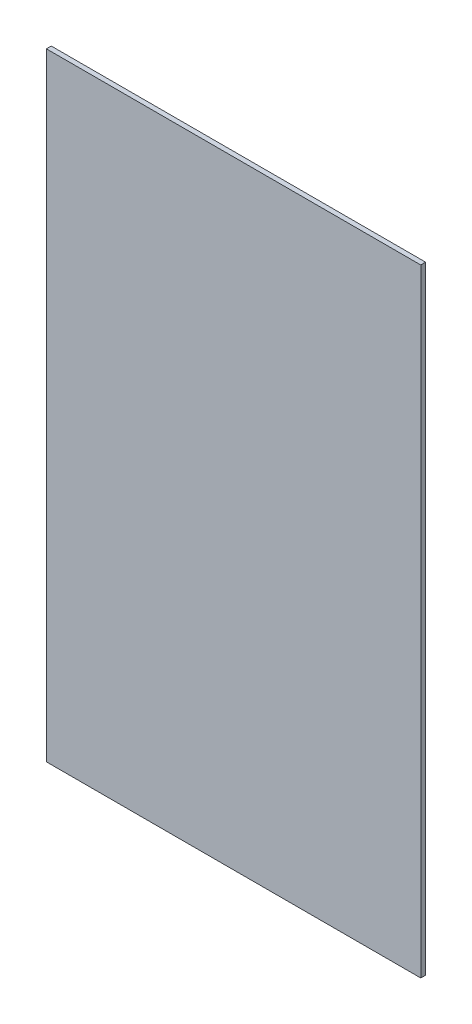
ISO-10303-21;
HEADER;
FILE_DESCRIPTION(('STEP AP214'),'2;1');
FILE_NAME('part.step','',(''),(''),'','','');
FILE_SCHEMA(('AUTOMOTIVE_DESIGN { 1 0 10303 214 1 1 1 1 }'));
ENDSEC;
DATA;
#1=APPLICATION_CONTEXT('core data for automotive mechanical design processes');
#2=APPLICATION_PROTOCOL_DEFINITION('international standard','automotive_design',2000,#1);
#3=PRODUCT_CONTEXT('',#1,'mechanical');
#4=PRODUCT('Part','Part','',(#3));
#5=PRODUCT_RELATED_PRODUCT_CATEGORY('part','',(#4));
#6=PRODUCT_DEFINITION_FORMATION('','',#4);
#7=PRODUCT_DEFINITION_CONTEXT('part definition',#1,'design');
#8=PRODUCT_DEFINITION('design','',#6,#7);
#9=PRODUCT_DEFINITION_SHAPE('','',#8);
#10=(LENGTH_UNIT() NAMED_UNIT(*) SI_UNIT(.MILLI.,.METRE.));
#11=(NAMED_UNIT(*) PLANE_ANGLE_UNIT() SI_UNIT($,.RADIAN.));
#12=(NAMED_UNIT(*) SI_UNIT($,.STERADIAN.) SOLID_ANGLE_UNIT());
#13=UNCERTAINTY_MEASURE_WITH_UNIT(LENGTH_MEASURE(1.E-05),#10,'distance_accuracy_value','');
#14=(GEOMETRIC_REPRESENTATION_CONTEXT(3) GLOBAL_UNCERTAINTY_ASSIGNED_CONTEXT((#13)) GLOBAL_UNIT_ASSIGNED_CONTEXT((#10,
#11,#12)) REPRESENTATION_CONTEXT('',''));
#15=CARTESIAN_POINT('',(0.,0.,0.));
#16=DIRECTION('',(0.,0.,1.));
#17=DIRECTION('',(1.,0.,0.));
#18=AXIS2_PLACEMENT_3D('',#15,#16,#17);
#19=CARTESIAN_POINT('',(0.,0.,0.));
#20=DIRECTION('',(0.,0.,1.));
#21=DIRECTION('',(1.,0.,0.));
#22=AXIS2_PLACEMENT_3D('',#19,#20,#21);
#23=PLANE('',#22);
#24=DIRECTION('',(1.,0.,0.));
#25=VECTOR('',#24,1.);
#26=CARTESIAN_POINT('',(3.85,6.35,0.));
#27=LINE('',#26,#25);
#28=CARTESIAN_POINT('',(3.85,6.35,0.));
#29=VERTEX_POINT('',#28);
#30=CARTESIAN_POINT('',(-3.85,6.35,0.));
#31=VERTEX_POINT('',#30);
#32=EDGE_CURVE('E79',#29,#31,#27,.F.);
#33=ORIENTED_EDGE('',*,*,#32,.F.);
#34=DIRECTION('',(0.,1.,0.));
#35=VECTOR('',#34,1.);
#36=CARTESIAN_POINT('',(3.85,-6.35,0.));
#37=LINE('',#36,#35);
#38=CARTESIAN_POINT('',(3.85,-6.35,0.));
#39=VERTEX_POINT('',#38);
#40=EDGE_CURVE('E55',#39,#29,#37,.T.);
#41=ORIENTED_EDGE('',*,*,#40,.F.);
#42=DIRECTION('',(1.,0.,0.));
#43=VECTOR('',#42,1.);
#44=CARTESIAN_POINT('',(-3.85,-6.35,0.));
#45=LINE('',#44,#43);
#46=CARTESIAN_POINT('',(-3.85,-6.35,0.));
#47=VERTEX_POINT('',#46);
#48=EDGE_CURVE('E57',#47,#39,#45,.T.);
#49=ORIENTED_EDGE('',*,*,#48,.F.);
#50=DIRECTION('',(0.,1.,0.));
#51=VECTOR('',#50,1.);
#52=CARTESIAN_POINT('',(-3.85,6.35,0.));
#53=LINE('',#52,#51);
#54=EDGE_CURVE('E20',#31,#47,#53,.F.);
#55=ORIENTED_EDGE('',*,*,#54,.F.);
#56=EDGE_LOOP('',(#33,#41,#49,#55));
#57=FACE_BOUND('',#56,.T.);
#58=ADVANCED_FACE('F17',(#57),#23,.F.);
#59=CARTESIAN_POINT('',(-3.85,6.35,0.));
#60=DIRECTION('',(-1.,0.,0.));
#61=DIRECTION('',(0.,0.,1.));
#62=AXIS2_PLACEMENT_3D('',#59,#60,#61);
#63=PLANE('',#62);
#64=DIRECTION('',(0.,1.,0.));
#65=VECTOR('',#64,1.);
#66=CARTESIAN_POINT('',(-3.85,0.,0.1));
#67=LINE('',#66,#65);
#68=CARTESIAN_POINT('',(-3.85,6.35,0.1));
#69=VERTEX_POINT('',#68);
#70=CARTESIAN_POINT('',(-3.85,-6.35,0.1));
#71=VERTEX_POINT('',#70);
#72=EDGE_CURVE('E83',#69,#71,#67,.F.);
#73=ORIENTED_EDGE('',*,*,#72,.F.);
#74=DIRECTION('',(0.,0.,1.));
#75=VECTOR('',#74,1.);
#76=CARTESIAN_POINT('',(-3.85,6.35,0.));
#77=LINE('',#76,#75);
#78=EDGE_CURVE('E68',#31,#69,#77,.T.);
#79=ORIENTED_EDGE('',*,*,#78,.F.);
#80=ORIENTED_EDGE('',*,*,#54,.T.);
#81=DIRECTION('',(0.,0.,-1.));
#82=VECTOR('',#81,1.);
#83=CARTESIAN_POINT('',(-3.85,-6.35,0.));
#84=LINE('',#83,#82);
#85=EDGE_CURVE('E63',#71,#47,#84,.T.);
#86=ORIENTED_EDGE('',*,*,#85,.F.);
#87=EDGE_LOOP('',(#73,#79,#80,#86));
#88=FACE_BOUND('',#87,.T.);
#89=ADVANCED_FACE('F65',(#88),#63,.T.);
#90=CARTESIAN_POINT('',(-3.85,-6.35,0.));
#91=DIRECTION('',(0.,-1.,0.));
#92=DIRECTION('',(0.,0.,-1.));
#93=AXIS2_PLACEMENT_3D('',#90,#91,#92);
#94=PLANE('',#93);
#95=DIRECTION('',(1.,0.,0.));
#96=VECTOR('',#95,1.);
#97=CARTESIAN_POINT('',(0.,-6.35,0.1));
#98=LINE('',#97,#96);
#99=CARTESIAN_POINT('',(3.85,-6.35,0.1));
#100=VERTEX_POINT('',#99);
#101=EDGE_CURVE('E72',#71,#100,#98,.T.);
#102=ORIENTED_EDGE('',*,*,#101,.F.);
#103=ORIENTED_EDGE('',*,*,#85,.T.);
#104=ORIENTED_EDGE('',*,*,#48,.T.);
#105=DIRECTION('',(0.,0.,-1.));
#106=VECTOR('',#105,1.);
#107=CARTESIAN_POINT('',(3.85,-6.35,0.));
#108=LINE('',#107,#106);
#109=EDGE_CURVE('E75',#100,#39,#108,.T.);
#110=ORIENTED_EDGE('',*,*,#109,.F.);
#111=EDGE_LOOP('',(#102,#103,#104,#110));
#112=FACE_BOUND('',#111,.T.);
#113=ADVANCED_FACE('F70',(#112),#94,.T.);
#114=CARTESIAN_POINT('',(3.85,-6.35,0.));
#115=DIRECTION('',(1.,0.,0.));
#116=DIRECTION('',(0.,0.,-1.));
#117=AXIS2_PLACEMENT_3D('',#114,#115,#116);
#118=PLANE('',#117);
#119=DIRECTION('',(0.,1.,0.));
#120=VECTOR('',#119,1.);
#121=CARTESIAN_POINT('',(3.85,0.,0.1));
#122=LINE('',#121,#120);
#123=CARTESIAN_POINT('',(3.85,6.35,0.1));
#124=VERTEX_POINT('',#123);
#125=EDGE_CURVE('E26',#100,#124,#122,.T.);
#126=ORIENTED_EDGE('',*,*,#125,.F.);
#127=ORIENTED_EDGE('',*,*,#109,.T.);
#128=ORIENTED_EDGE('',*,*,#40,.T.);
#129=DIRECTION('',(0.,0.,1.));
#130=VECTOR('',#129,1.);
#131=CARTESIAN_POINT('',(3.85,6.35,0.));
#132=LINE('',#131,#130);
#133=EDGE_CURVE('E35',#124,#29,#132,.F.);
#134=ORIENTED_EDGE('',*,*,#133,.F.);
#135=EDGE_LOOP('',(#126,#127,#128,#134));
#136=FACE_BOUND('',#135,.T.);
#137=ADVANCED_FACE('F89',(#136),#118,.T.);
#138=CARTESIAN_POINT('',(3.85,6.35,0.));
#139=DIRECTION('',(0.,1.,0.));
#140=DIRECTION('',(0.,0.,1.));
#141=AXIS2_PLACEMENT_3D('',#138,#139,#140);
#142=PLANE('',#141);
#143=DIRECTION('',(1.,0.,0.));
#144=VECTOR('',#143,1.);
#145=CARTESIAN_POINT('',(0.,6.35,0.1));
#146=LINE('',#145,#144);
#147=EDGE_CURVE('E11',#124,#69,#146,.F.);
#148=ORIENTED_EDGE('',*,*,#147,.F.);
#149=ORIENTED_EDGE('',*,*,#133,.T.);
#150=ORIENTED_EDGE('',*,*,#32,.T.);
#151=ORIENTED_EDGE('',*,*,#78,.T.);
#152=EDGE_LOOP('',(#148,#149,#150,#151));
#153=FACE_BOUND('',#152,.T.);
#154=ADVANCED_FACE('F91',(#153),#142,.T.);
#155=CARTESIAN_POINT('',(0.,0.,0.1));
#156=DIRECTION('',(0.,0.,1.));
#157=DIRECTION('',(1.,0.,0.));
#158=AXIS2_PLACEMENT_3D('',#155,#156,#157);
#159=PLANE('',#158);
#160=ORIENTED_EDGE('',*,*,#125,.T.);
#161=ORIENTED_EDGE('',*,*,#147,.T.);
#162=ORIENTED_EDGE('',*,*,#72,.T.);
#163=ORIENTED_EDGE('',*,*,#101,.T.);
#164=EDGE_LOOP('',(#160,#161,#162,#163));
#165=FACE_BOUND('',#164,.T.);
#166=ADVANCED_FACE('F88',(#165),#159,.T.);
#167=CLOSED_SHELL('',(#58,#89,#113,#137,#154,#166));
#168=MANIFOLD_SOLID_BREP('B1',#167);
#169=ADVANCED_BREP_SHAPE_REPRESENTATION('',(#18,#168),#14);
#170=SHAPE_DEFINITION_REPRESENTATION(#9,#169);
ENDSEC;
END-ISO-10303-21;
